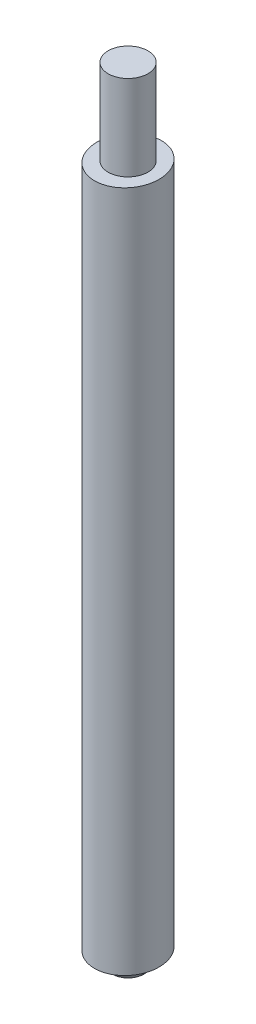
ISO-10303-21;
HEADER;
FILE_DESCRIPTION(('STEP AP214'),'2;1');
FILE_NAME('part.step','',(''),(''),'','','');
FILE_SCHEMA(('AUTOMOTIVE_DESIGN { 1 0 10303 214 1 1 1 1 }'));
ENDSEC;
DATA;
#1=APPLICATION_CONTEXT('core data for automotive mechanical design processes');
#2=APPLICATION_PROTOCOL_DEFINITION('international standard','automotive_design',2000,#1);
#3=PRODUCT_CONTEXT('',#1,'mechanical');
#4=PRODUCT('Part','Part','',(#3));
#5=PRODUCT_RELATED_PRODUCT_CATEGORY('part','',(#4));
#6=PRODUCT_DEFINITION_FORMATION('','',#4);
#7=PRODUCT_DEFINITION_CONTEXT('part definition',#1,'design');
#8=PRODUCT_DEFINITION('design','',#6,#7);
#9=PRODUCT_DEFINITION_SHAPE('','',#8);
#10=(LENGTH_UNIT() NAMED_UNIT(*) SI_UNIT(.MILLI.,.METRE.));
#11=(NAMED_UNIT(*) PLANE_ANGLE_UNIT() SI_UNIT($,.RADIAN.));
#12=(NAMED_UNIT(*) SI_UNIT($,.STERADIAN.) SOLID_ANGLE_UNIT());
#13=UNCERTAINTY_MEASURE_WITH_UNIT(LENGTH_MEASURE(1.E-05),#10,'distance_accuracy_value','');
#14=(GEOMETRIC_REPRESENTATION_CONTEXT(3) GLOBAL_UNCERTAINTY_ASSIGNED_CONTEXT((#13)) GLOBAL_UNIT_ASSIGNED_CONTEXT((#10,
#11,#12)) REPRESENTATION_CONTEXT('',''));
#15=CARTESIAN_POINT('',(0.,0.,0.));
#16=DIRECTION('',(0.,0.,1.));
#17=DIRECTION('',(1.,0.,0.));
#18=AXIS2_PLACEMENT_3D('',#15,#16,#17);
#19=CARTESIAN_POINT('',(-99.5832510074015,-22.870352222622,71.5449505559773));
#20=DIRECTION('',(0.,1.,0.));
#21=DIRECTION('',(1.,0.,0.));
#22=AXIS2_PLACEMENT_3D('',#19,#20,#21);
#23=PLANE('',#22);
#24=CARTESIAN_POINT('',(-96.5466540829582,-22.870352222622,77.6888931627985));
#25=CARTESIAN_POINT('',(-96.5466024115856,-22.870352222622,77.7217110537434));
#26=CARTESIAN_POINT('',(-96.5440582556821,-22.870352222622,77.7545139383835));
#27=CARTESIAN_POINT('',(-96.5390472767787,-22.870352222622,77.7869706485071));
#28=CARTESIAN_POINT('',(-96.5316683328519,-22.870352222622,77.8347649515097));
#29=CARTESIAN_POINT('',(-96.5189637767844,-22.8703522226164,77.8816564286544));
#30=CARTESIAN_POINT('',(-96.5011194939739,-22.8703522226164,77.9265981922167));
#31=CARTESIAN_POINT('',(-96.4722009205017,-22.8703522226164,77.999431138508));
#32=CARTESIAN_POINT('',(-96.4300380197235,-22.8703522226035,78.0664980948612));
#33=CARTESIAN_POINT('',(-96.3762481160368,-22.8703522226035,78.1233743738149));
#34=CARTESIAN_POINT('',(-96.3265885109153,-22.8703522226035,78.175883364537));
#35=CARTESIAN_POINT('',(-96.2677787319174,-22.8703522225925,78.2188786993219));
#36=CARTESIAN_POINT('',(-96.2022845901575,-22.8703522225925,78.2492453314144));
#37=CARTESIAN_POINT('',(-96.1404036395919,-22.8703522225925,78.2779366923341));
#38=CARTESIAN_POINT('',(-96.0738764668503,-22.8703522225814,78.2947223282512));
#39=CARTESIAN_POINT('',(-96.0058011706707,-22.8703522225814,78.2981584592726));
#40=CARTESIAN_POINT('',(-95.938106392847,-22.8703522225814,78.3015753834597));
#41=CARTESIAN_POINT('',(-95.8706592375868,-22.8703522225707,78.2916915807209));
#42=CARTESIAN_POINT('',(-95.8067741517704,-22.8703522225707,78.2690396767369));
#43=CARTESIAN_POINT('',(-95.7395275328239,-22.8703522225707,78.2451958650529));
#44=CARTESIAN_POINT('',(-95.6780937989401,-22.870352222622,78.2078830497993));
#45=CARTESIAN_POINT('',(-95.625319883913,-22.870352222622,78.1597835829877));
#46=CARTESIAN_POINT('',(-95.5687267193618,-22.870352222622,78.108203156584));
#47=CARTESIAN_POINT('',(-95.5234237996667,-22.8703522226117,78.0454663224445));
#48=CARTESIAN_POINT('',(-95.4910571519574,-22.8703522226117,77.9759685385292));
#49=CARTESIAN_POINT('',(-95.4560384352353,-22.8703522226117,77.9007762223644));
#50=CARTESIAN_POINT('',(-95.4367335475989,-22.870352222622,77.8189460424284));
#51=CARTESIAN_POINT('',(-95.4334596961054,-22.870352222622,77.735984861668));
#52=CARTESIAN_POINT('',(-95.4330921233536,-22.870352222622,77.7266703678484));
#53=CARTESIAN_POINT('',(-95.4329270851143,-22.870352222622,77.717353058822));
#54=CARTESIAN_POINT('',(-95.4329634956106,-22.8703522226221,77.7080404270808));
#55=B_SPLINE_CURVE_WITH_KNOTS('',3,(#24,#25,#26,#27,#28,#29,#30,#31,#32,#33,#34,#35,#36,#37,#38,
#39,#40,#41,#42,#43,#44,#45,#46,#47,#48,#49,#50,#51,#52,#53,#54),.UNSPECIFIED.,.F.,.F.,(4,3,3,3,
3,3,3,3,3,3,4),(0.00468065687562563,0.0145325449219714,0.0290399956352967,0.0525508749349579,
0.0742564535298472,0.094764575324147,0.115158063510846,0.136624625096453,0.159644722270168,
0.184551047728562,0.187347413600204),.UNSPECIFIED.);
#56=CARTESIAN_POINT('',(-96.54665405746,-22.870352222622,77.6888931627584));
#57=VERTEX_POINT('',#56);
#58=CARTESIAN_POINT('',(-95.432963477877,-22.870352222622,77.7080404270115));
#59=VERTEX_POINT('',#58);
#60=EDGE_CURVE('P0_E11',#57,#59,#55,.T.);
#61=ORIENTED_EDGE('',*,*,#60,.T.);
#62=CARTESIAN_POINT('',(-95.4329634956106,-22.8703522226221,77.7080404270808));
#63=CARTESIAN_POINT('',(-95.4332536325831,-22.8703522226224,77.6338327383096));
#64=CARTESIAN_POINT('',(-95.4463351524137,-22.8703522226238,77.5599220429451));
#65=CARTESIAN_POINT('',(-95.471658678746,-22.8703522226238,77.4900993579032));
#66=CARTESIAN_POINT('',(-95.4986622680001,-22.8703522226238,77.4156443597037));
#67=CARTESIAN_POINT('',(-95.5393063058934,-22.8703522226267,77.3466126942105));
#68=CARTESIAN_POINT('',(-95.5919594229849,-22.8703522226267,77.287553362915));
#69=CARTESIAN_POINT('',(-95.6404930833903,-22.8703522226267,77.2331146955161));
#70=CARTESIAN_POINT('',(-95.6985451053909,-22.8703522226243,77.1879417752959));
#71=CARTESIAN_POINT('',(-95.763684291754,-22.8703522226243,77.1553277087607));
#72=CARTESIAN_POINT('',(-95.8247396710747,-22.8703522226243,77.1247583339392));
#73=CARTESIAN_POINT('',(-95.8907845894538,-22.8703522226174,77.1058621143656));
#74=CARTESIAN_POINT('',(-95.9587861060318,-22.8703522226174,77.1002904823695));
#75=CARTESIAN_POINT('',(-96.0258921991616,-22.8703522226174,77.0947922159421));
#76=CARTESIAN_POINT('',(-96.0931495115276,-22.870352222608,77.1024257725012));
#77=CARTESIAN_POINT('',(-96.1572973280932,-22.870352222608,77.1228719139359));
#78=CARTESIAN_POINT('',(-96.2247319996104,-22.870352222608,77.1443656904237));
#79=CARTESIAN_POINT('',(-96.2867981147807,-22.870352222622,77.1793880307547));
#80=CARTESIAN_POINT('',(-96.3406425677685,-22.870352222622,77.2254048486341));
#81=CARTESIAN_POINT('',(-96.3810431223386,-22.870352222622,77.259932174268));
#82=CARTESIAN_POINT('',(-96.4161287374219,-22.870352222622,77.3000491742677));
#83=CARTESIAN_POINT('',(-96.4453250312548,-22.870352222622,77.3442694937709));
#84=B_SPLINE_CURVE_WITH_KNOTS('',3,(#62,#63,#64,#65,#66,#67,#68,#69,#70,#71,#72,#73,#74,#75,#76,
#77,#78,#79,#80,#81,#82,#83),.UNSPECIFIED.,.F.,.F.,(4,3,3,3,3,3,3,4),(0.187347413600204,
0.209630249866136,0.233391417645115,0.255293567252229,0.275822593278851,0.296081299286169,
0.31737803638669,0.33335739807863),.UNSPECIFIED.);
#85=CARTESIAN_POINT('',(-96.4453250312547,-22.870352222622,77.3442694937709));
#86=VERTEX_POINT('',#85);
#87=EDGE_CURVE('P0_E31',#59,#86,#84,.T.);
#88=ORIENTED_EDGE('',*,*,#87,.T.);
#89=CARTESIAN_POINT('',(-96.4453250312548,-22.870352222622,77.3442694937709));
#90=CARTESIAN_POINT('',(-96.4579423399502,-22.870352222622,77.3633795022185));
#91=CARTESIAN_POINT('',(-96.4694588568553,-22.8703522226207,77.3832564417114));
#92=CARTESIAN_POINT('',(-96.4798279819889,-22.8703522226207,77.4037805116341));
#93=CARTESIAN_POINT('',(-96.5172763288098,-22.8703522226207,77.4779036877693));
#94=CARTESIAN_POINT('',(-96.5391578744477,-22.870352222622,77.5592191852177));
#95=CARTESIAN_POINT('',(-96.5450371497492,-22.870352222622,77.6421429274782));
#96=CARTESIAN_POINT('',(-96.5461405717466,-22.870352222622,77.6577060499077));
#97=CARTESIAN_POINT('',(-96.5466786321577,-22.870352222622,77.6733012999828));
#98=CARTESIAN_POINT('',(-96.5466540829582,-22.870352222622,77.6888931627985));
#99=B_SPLINE_CURVE_WITH_KNOTS('',3,(#89,#90,#91,#92,#93,#94,#95,#96,#97,#98),.UNSPECIFIED.,.F.,
.F.,(4,3,3,4),(-0.0318451226781048,-0.0249395702002057,0.,0.00468065687562563),.UNSPECIFIED.);
#100=EDGE_CURVE('P0_E52',#86,#57,#99,.T.);
#101=ORIENTED_EDGE('',*,*,#100,.T.);
#102=EDGE_LOOP('',(#61,#88,#101));
#103=FACE_BOUND('',#102,.T.);
#104=ADVANCED_FACE('P0_F17',(#103),#23,.T.);
#105=CARTESIAN_POINT('',(-96.4453250312548,-22.870352222622,77.3442694937709));
#106=CARTESIAN_POINT('',(-96.4453250312548,-34.870352222622,77.3442694937709));
#107=CARTESIAN_POINT('',(-96.4161287374219,-22.870352222622,77.3000491742677));
#108=CARTESIAN_POINT('',(-96.4161287374219,-34.870352222622,77.3000491742677));
#109=CARTESIAN_POINT('',(-96.3810431223386,-22.870352222622,77.259932174268));
#110=CARTESIAN_POINT('',(-96.3810431223386,-34.870352222622,77.259932174268));
#111=CARTESIAN_POINT('',(-96.2867981147807,-22.870352222622,77.1793880307547));
#112=CARTESIAN_POINT('',(-96.2867981147807,-34.8703522226221,77.1793880307547));
#113=CARTESIAN_POINT('',(-96.2247319996104,-22.870352222608,77.1443656904237));
#114=CARTESIAN_POINT('',(-96.2247319996104,-34.870352222608,77.1443656904237));
#115=CARTESIAN_POINT('',(-96.0931495115276,-22.870352222608,77.1024257725012));
#116=CARTESIAN_POINT('',(-96.0931495115276,-34.870352222608,77.1024257725012));
#117=CARTESIAN_POINT('',(-96.0258921991616,-22.8703522226174,77.0947922159421));
#118=CARTESIAN_POINT('',(-96.0258921991616,-34.8703522226174,77.0947922159421));
#119=CARTESIAN_POINT('',(-95.8907845894538,-22.8703522226174,77.1058621143656));
#120=CARTESIAN_POINT('',(-95.8907845894538,-34.8703522226174,77.1058621143656));
#121=CARTESIAN_POINT('',(-95.8247396710747,-22.8703522226243,77.1247583339392));
#122=CARTESIAN_POINT('',(-95.8247396710747,-34.8703522226243,77.1247583339392));
#123=CARTESIAN_POINT('',(-95.6985451053909,-22.8703522226243,77.1879417752959));
#124=CARTESIAN_POINT('',(-95.6985451053909,-34.8703522226243,77.1879417752959));
#125=CARTESIAN_POINT('',(-95.6404930833903,-22.8703522226267,77.2331146955161));
#126=CARTESIAN_POINT('',(-95.6404930833903,-34.8703522226267,77.2331146955161));
#127=CARTESIAN_POINT('',(-95.5393063058934,-22.8703522226267,77.3466126942105));
#128=CARTESIAN_POINT('',(-95.5393063058934,-34.8703522226267,77.3466126942105));
#129=CARTESIAN_POINT('',(-95.4986622680001,-22.8703522226238,77.4156443597037));
#130=CARTESIAN_POINT('',(-95.4986622680001,-34.8703522226238,77.4156443597037));
#131=CARTESIAN_POINT('',(-95.4431571976892,-22.8703522226238,77.5686843823164));
#132=CARTESIAN_POINT('',(-95.4431571976892,-34.8703522226238,77.5686843823164));
#133=CARTESIAN_POINT('',(-95.4301631205624,-22.870352222622,77.6524478411091));
#134=CARTESIAN_POINT('',(-95.4301631205624,-34.870352222622,77.6524478411091));
#135=CARTESIAN_POINT('',(-95.4367335475989,-22.870352222622,77.8189460424284));
#136=CARTESIAN_POINT('',(-95.4367335475989,-34.870352222622,77.8189460424284));
#137=CARTESIAN_POINT('',(-95.4560384352353,-22.8703522226117,77.9007762223644));
#138=CARTESIAN_POINT('',(-95.4560384352353,-34.8703522226117,77.9007762223644));
#139=CARTESIAN_POINT('',(-95.5234237996667,-22.8703522226117,78.0454663224445));
#140=CARTESIAN_POINT('',(-95.5234237996667,-34.8703522226117,78.0454663224445));
#141=CARTESIAN_POINT('',(-95.5687267193618,-22.870352222622,78.108203156584));
#142=CARTESIAN_POINT('',(-95.5687267193618,-34.870352222622,78.108203156584));
#143=CARTESIAN_POINT('',(-95.6780937989401,-22.870352222622,78.2078830497993));
#144=CARTESIAN_POINT('',(-95.6780937989401,-34.870352222622,78.2078830497993));
#145=CARTESIAN_POINT('',(-95.7395275328239,-22.8703522225707,78.2451958650529));
#146=CARTESIAN_POINT('',(-95.7395275328239,-34.8703522225707,78.2451958650529));
#147=CARTESIAN_POINT('',(-95.8706592375868,-22.8703522225707,78.2916915807209));
#148=CARTESIAN_POINT('',(-95.8706592375868,-34.8703522225707,78.2916915807209));
#149=CARTESIAN_POINT('',(-95.938106392847,-22.8703522225814,78.3015753834597));
#150=CARTESIAN_POINT('',(-95.938106392847,-34.8703522225814,78.3015753834597));
#151=CARTESIAN_POINT('',(-96.0738764668503,-22.8703522225814,78.2947223282512));
#152=CARTESIAN_POINT('',(-96.0738764668503,-34.8703522225814,78.2947223282512));
#153=CARTESIAN_POINT('',(-96.1404036395919,-22.8703522225925,78.2779366923341));
#154=CARTESIAN_POINT('',(-96.1404036395919,-34.8703522225925,78.2779366923341));
#155=CARTESIAN_POINT('',(-96.2677787319174,-22.8703522225925,78.2188786993219));
#156=CARTESIAN_POINT('',(-96.2677787319174,-34.8703522225925,78.2188786993219));
#157=CARTESIAN_POINT('',(-96.3265885109153,-22.8703522226035,78.175883364537));
#158=CARTESIAN_POINT('',(-96.3265885109153,-34.8703522226035,78.175883364537));
#159=CARTESIAN_POINT('',(-96.4300380197235,-22.8703522226035,78.0664980948612));
#160=CARTESIAN_POINT('',(-96.4300380197235,-34.8703522226035,78.0664980948612));
#161=CARTESIAN_POINT('',(-96.4722009205017,-22.8703522226164,77.999431138508));
#162=CARTESIAN_POINT('',(-96.4722009205017,-34.8703522226164,77.999431138508));
#163=CARTESIAN_POINT('',(-96.5189637767844,-22.8703522226164,77.8816564286544));
#164=CARTESIAN_POINT('',(-96.5189637767844,-34.8703522226164,77.8816564286544));
#165=CARTESIAN_POINT('',(-96.5316683328519,-22.870352222622,77.8347649515097));
#166=CARTESIAN_POINT('',(-96.5316683328519,-34.870352222622,77.8347649515097));
#167=CARTESIAN_POINT('',(-96.5464389844061,-22.870352222622,77.7390936734875));
#168=CARTESIAN_POINT('',(-96.5464389844061,-34.870352222622,77.7390936734875));
#169=CARTESIAN_POINT('',(-96.5484630641392,-22.870352222622,77.6904634478331));
#170=CARTESIAN_POINT('',(-96.5484630641392,-34.870352222622,77.6904634478331));
#171=CARTESIAN_POINT('',(-96.5450371497492,-22.870352222622,77.6421429274782));
#172=CARTESIAN_POINT('',(-96.5450371497492,-34.870352222622,77.6421429274782));
#173=CARTESIAN_POINT('',(-96.5391578744477,-22.870352222622,77.5592191852177));
#174=CARTESIAN_POINT('',(-96.5391578744477,-34.870352222622,77.5592191852177));
#175=CARTESIAN_POINT('',(-96.5172763288098,-22.8703522226207,77.4779036877693));
#176=CARTESIAN_POINT('',(-96.5172763288098,-34.8703522226207,77.4779036877693));
#177=CARTESIAN_POINT('',(-96.4694588568553,-22.8703522226207,77.3832564417114));
#178=CARTESIAN_POINT('',(-96.4694588568553,-34.8703522226207,77.3832564417114));
#179=CARTESIAN_POINT('',(-96.4579423399502,-22.870352222622,77.3633795022185));
#180=CARTESIAN_POINT('',(-96.4579423399502,-34.870352222622,77.3633795022185));
#181=CARTESIAN_POINT('',(-96.4453250312548,-22.870352222622,77.3442694937709));
#182=CARTESIAN_POINT('',(-96.4453250312548,-34.870352222622,77.3442694937709));
#183=B_SPLINE_SURFACE_WITH_KNOTS('',3,1,((#105,#106),(#107,#108),(#109,#110),(#111,#112),(#113,
#114),(#115,#116),(#117,#118),(#119,#120),(#121,#122),(#123,#124),(#125,#126),(#127,#128),(#129,
#130),(#131,#132),(#133,#134),(#135,#136),(#137,#138),(#139,#140),(#141,#142),(#143,#144),(#145,
#146),(#147,#148),(#149,#150),(#151,#152),(#153,#154),(#155,#156),(#157,#158),(#159,#160),(#161,
#162),(#163,#164),(#165,#166),(#167,#168),(#169,#170),(#171,#172),(#173,#174),(#175,#176),(#177,
#178),(#179,#180),(#181,#182)),.UNSPECIFIED.,.T.,.F.,.F.,(4,2,2,2,2,2,2,2,2,2,2,2,2,2,2,2,3,2,
4),(2,2),(-0.33335739807863,-0.31737803638669,-0.296081299286169,-0.275822593278851,
-0.255293567252229,-0.233391417645115,-0.209630249866136,-0.184551047728562,-0.159644722270168,
-0.136624625096453,-0.115158063510846,-0.0947645753241469,-0.0742564535298472,
-0.0525508749349579,-0.0290399956352967,-0.0145325449219714,0.,0.0249395702002057,
0.0318451226781048),(0.,1.2),.UNSPECIFIED.);
#184=CARTESIAN_POINT('',(-96.4453250312548,-34.870352222622,77.3442694937709));
#185=CARTESIAN_POINT('',(-96.4161287374219,-34.870352222622,77.3000491742677));
#186=CARTESIAN_POINT('',(-96.3810431223386,-34.870352222622,77.259932174268));
#187=CARTESIAN_POINT('',(-96.3406425677685,-34.870352222622,77.2254048486341));
#188=CARTESIAN_POINT('',(-96.2867981147807,-34.870352222622,77.1793880307547));
#189=CARTESIAN_POINT('',(-96.2247319996104,-34.870352222608,77.1443656904237));
#190=CARTESIAN_POINT('',(-96.1572973280932,-34.870352222608,77.1228719139359));
#191=CARTESIAN_POINT('',(-96.0931495115276,-34.870352222608,77.1024257725012));
#192=CARTESIAN_POINT('',(-96.0258921991616,-34.8703522226174,77.0947922159421));
#193=CARTESIAN_POINT('',(-95.9587861060318,-34.8703522226174,77.1002904823695));
#194=CARTESIAN_POINT('',(-95.8907845894538,-34.8703522226174,77.1058621143656));
#195=CARTESIAN_POINT('',(-95.8247396710747,-34.8703522226243,77.1247583339392));
#196=CARTESIAN_POINT('',(-95.763684291754,-34.8703522226243,77.1553277087607));
#197=CARTESIAN_POINT('',(-95.6985451053909,-34.8703522226243,77.1879417752959));
#198=CARTESIAN_POINT('',(-95.6404930833903,-34.8703522226267,77.2331146955161));
#199=CARTESIAN_POINT('',(-95.5919594229849,-34.8703522226267,77.287553362915));
#200=CARTESIAN_POINT('',(-95.5393063058934,-34.8703522226266,77.3466126942105));
#201=CARTESIAN_POINT('',(-95.4986622680001,-34.8703522226237,77.4156443597037));
#202=CARTESIAN_POINT('',(-95.471658678746,-34.8703522226237,77.4900993579032));
#203=CARTESIAN_POINT('',(-95.4431571976892,-34.8703522226237,77.5686843823164));
#204=CARTESIAN_POINT('',(-95.4301631205624,-34.870352222622,77.6524478411091));
#205=CARTESIAN_POINT('',(-95.4334596961054,-34.870352222622,77.735984861668));
#206=CARTESIAN_POINT('',(-95.4367335475989,-34.870352222622,77.8189460424284));
#207=CARTESIAN_POINT('',(-95.4560384352353,-34.8703522226117,77.9007762223644));
#208=CARTESIAN_POINT('',(-95.4910571519574,-34.8703522226117,77.9759685385292));
#209=CARTESIAN_POINT('',(-95.5234237996667,-34.8703522226117,78.0454663224445));
#210=CARTESIAN_POINT('',(-95.5687267193618,-34.8703522226219,78.108203156584));
#211=CARTESIAN_POINT('',(-95.625319883913,-34.8703522226219,78.1597835829877));
#212=CARTESIAN_POINT('',(-95.6780937989401,-34.8703522226219,78.2078830497993));
#213=CARTESIAN_POINT('',(-95.7395275328239,-34.8703522225706,78.2451958650529));
#214=CARTESIAN_POINT('',(-95.8067741517704,-34.8703522225706,78.2690396767369));
#215=CARTESIAN_POINT('',(-95.8706592375868,-34.8703522225706,78.2916915807209));
#216=CARTESIAN_POINT('',(-95.938106392847,-34.8703522225813,78.3015753834597));
#217=CARTESIAN_POINT('',(-96.0058011706707,-34.8703522225813,78.2981584592726));
#218=CARTESIAN_POINT('',(-96.0738764668503,-34.8703522225813,78.2947223282512));
#219=CARTESIAN_POINT('',(-96.1404036395919,-34.8703522225925,78.2779366923341));
#220=CARTESIAN_POINT('',(-96.2022845901575,-34.8703522225925,78.2492453314144));
#221=CARTESIAN_POINT('',(-96.2677787319174,-34.8703522225925,78.2188786993219));
#222=CARTESIAN_POINT('',(-96.3265885109153,-34.8703522226034,78.175883364537));
#223=CARTESIAN_POINT('',(-96.3762481160368,-34.8703522226034,78.1233743738149));
#224=CARTESIAN_POINT('',(-96.4300380197235,-34.8703522226034,78.0664980948612));
#225=CARTESIAN_POINT('',(-96.4722009205017,-34.8703522226163,77.999431138508));
#226=CARTESIAN_POINT('',(-96.5011194939739,-34.8703522226163,77.9265981922167));
#227=CARTESIAN_POINT('',(-96.5189637767844,-34.8703522226163,77.8816564286544));
#228=CARTESIAN_POINT('',(-96.5316683328519,-34.8703522226219,77.8347649515097));
#229=CARTESIAN_POINT('',(-96.5390472767787,-34.8703522226219,77.7869706485071));
#230=CARTESIAN_POINT('',(-96.5464389844061,-34.8703522226219,77.7390936734875));
#231=CARTESIAN_POINT('',(-96.5484630641392,-34.8703522226218,77.6904634478331));
#232=CARTESIAN_POINT('',(-96.5450371497492,-34.8703522226218,77.6421429274782));
#233=CARTESIAN_POINT('',(-96.5391578744477,-34.8703522226218,77.5592191852177));
#234=CARTESIAN_POINT('',(-96.5172763288098,-34.8703522226205,77.4779036877693));
#235=CARTESIAN_POINT('',(-96.4798279819889,-34.8703522226205,77.4037805116341));
#236=CARTESIAN_POINT('',(-96.4694588568553,-34.8703522226205,77.3832564417115));
#237=CARTESIAN_POINT('',(-96.4579423399502,-34.8703522226219,77.3633795022185));
#238=CARTESIAN_POINT('',(-96.4453250312548,-34.870352222622,77.3442694937709));
#239=B_SPLINE_CURVE_WITH_KNOTS('',3,(#184,#185,#186,#187,#188,#189,#190,#191,#192,#193,#194,
#195,#196,#197,#198,#199,#200,#201,#202,#203,#204,#205,#206,#207,#208,#209,#210,#211,#212,#213,
#214,#215,#216,#217,#218,#219,#220,#221,#222,#223,#224,#225,#226,#227,#228,#229,#230,#231,#232,
#233,#234,#235,#236,#237,#238),.UNSPECIFIED.,.T.,.F.,(4,3,3,3,3,3,3,3,3,3,3,3,3,3,3,3,3,3,4),
(-0.33335739807863,-0.31737803638669,-0.296081299286168,-0.27582259327885,-0.255293567252229,
-0.233391417645114,-0.209630249866135,-0.184551047728561,-0.159644722270167,-0.136624625096452,
-0.115158063510844,-0.0947645753241454,-0.0742564535298456,-0.0525508749349561,
-0.0290399956352948,-0.0145325449219694,0.,0.024939570200208,0.0318451226781048),.UNSPECIFIED.);
#240=CARTESIAN_POINT('',(-96.4453250312548,-34.870352222622,77.3442694937709));
#241=VERTEX_POINT('',#240);
#242=EDGE_CURVE('P0_E23',#241,#241,#239,.T.);
#243=ORIENTED_EDGE('',*,*,#242,.F.);
#244=EDGE_LOOP('',(#243));
#245=FACE_BOUND('',#244,.T.);
#246=ORIENTED_EDGE('',*,*,#100,.F.);
#247=ORIENTED_EDGE('',*,*,#87,.F.);
#248=ORIENTED_EDGE('',*,*,#60,.F.);
#249=EDGE_LOOP('',(#246,#247,#248));
#250=FACE_BOUND('',#249,.T.);
#251=ADVANCED_FACE('P0_F19',(#245,#250),#183,.T.);
#252=CARTESIAN_POINT('',(-99.7399965644509,-34.870352222622,71.7040607694052));
#253=DIRECTION('',(0.,1.,0.));
#254=DIRECTION('',(1.,0.,0.));
#255=AXIS2_PLACEMENT_3D('',#252,#253,#254);
#256=PLANE('',#255);
#257=ORIENTED_EDGE('',*,*,#242,.T.);
#258=EDGE_LOOP('',(#257));
#259=FACE_BOUND('',#258,.T.);
#260=ADVANCED_FACE('P0_F80',(#259),#256,.F.);
#261=CLOSED_SHELL('',(#104,#251,#260));
#262=MANIFOLD_SOLID_BREP('P0_B1',#261);
#263=CARTESIAN_POINT('',(-81.665808000505,-21.3703528404236,27.730238100206));
#264=DIRECTION('',(0.,1.,0.));
#265=DIRECTION('',(0.,0.,-1.));
#266=AXIS2_PLACEMENT_3D('',#263,#264,#265);
#267=PLANE('',#266);
#268=CARTESIAN_POINT('',(-95.9898087676685,-21.3703528404236,77.698466794885));
#269=DIRECTION('',(0.,1.,0.));
#270=DIRECTION('',(2.1425115015461E-09,0.,1.));
#271=AXIS2_PLACEMENT_3D('',#268,#269,#270);
#272=CIRCLE('',#271,0.35);
#273=CARTESIAN_POINT('',(-95.9898087669186,-21.3703528404236,78.048466794885));
#274=VERTEX_POINT('',#273);
#275=EDGE_CURVE('P1_E10',#274,#274,#272,.T.);
#276=ORIENTED_EDGE('',*,*,#275,.T.);
#277=EDGE_LOOP('',(#276));
#278=FACE_BOUND('',#277,.T.);
#279=ADVANCED_FACE('P1_F15',(#278),#267,.T.);
#280=CARTESIAN_POINT('',(-95.9898087676685,-22.8703528404236,77.698466794885));
#281=DIRECTION('',(0.,1.,0.));
#282=DIRECTION('',(2.1425115015461E-09,0.,1.));
#283=AXIS2_PLACEMENT_3D('',#280,#281,#282);
#284=CYLINDRICAL_SURFACE('',#283,0.35);
#285=CARTESIAN_POINT('',(-95.9898087676685,-34.9703528404236,77.698466794885));
#286=DIRECTION('',(0.,-1.,0.));
#287=DIRECTION('',(2.14248936052691E-09,0.,1.));
#288=AXIS2_PLACEMENT_3D('',#285,#286,#287);
#289=CIRCLE('',#288,0.35);
#290=CARTESIAN_POINT('',(-95.9898087669186,-34.9703528404236,78.048466794885));
#291=VERTEX_POINT('',#290);
#292=EDGE_CURVE('P1_E23',#291,#291,#289,.T.);
#293=ORIENTED_EDGE('',*,*,#292,.F.);
#294=EDGE_LOOP('',(#293));
#295=FACE_BOUND('',#294,.T.);
#296=ORIENTED_EDGE('',*,*,#275,.F.);
#297=EDGE_LOOP('',(#296));
#298=FACE_BOUND('',#297,.T.);
#299=ADVANCED_FACE('P1_F49',(#295,#298),#284,.T.);
#300=CARTESIAN_POINT('',(-81.665808000505,-35.1703528404236,27.730238100206));
#301=DIRECTION('',(0.,1.,0.));
#302=DIRECTION('',(0.,0.,-1.));
#303=AXIS2_PLACEMENT_3D('',#300,#301,#302);
#304=PLANE('',#303);
#305=CARTESIAN_POINT('',(-95.9898087676685,-35.1703528404236,77.698466794885));
#306=DIRECTION('',(0.,1.,0.));
#307=DIRECTION('',(2.14248936052691E-09,0.,1.));
#308=AXIS2_PLACEMENT_3D('',#305,#306,#307);
#309=CIRCLE('',#308,0.15);
#310=CARTESIAN_POINT('',(-95.9898087673471,-35.1703528404236,77.848466794885));
#311=VERTEX_POINT('',#310);
#312=EDGE_CURVE('P1_E33',#311,#311,#309,.T.);
#313=ORIENTED_EDGE('',*,*,#312,.F.);
#314=EDGE_LOOP('',(#313));
#315=FACE_BOUND('',#314,.T.);
#316=ADVANCED_FACE('P1_F47',(#315),#304,.F.);
#317=CARTESIAN_POINT('',(-95.9898087676684,-34.9703528404237,77.698466794885));
#318=DIRECTION('',(0.,-1.,0.));
#319=DIRECTION('',(0.,0.,-1.));
#320=AXIS2_PLACEMENT_3D('',#317,#318,#319);
#321=DEGENERATE_TOROIDAL_SURFACE('',#320,0.149999999999914,0.199999999999944,.T.);
#322=ORIENTED_EDGE('',*,*,#292,.T.);
#323=EDGE_LOOP('',(#322));
#324=FACE_BOUND('',#323,.T.);
#325=ORIENTED_EDGE('',*,*,#312,.T.);
#326=EDGE_LOOP('',(#325));
#327=FACE_BOUND('',#326,.T.);
#328=ADVANCED_FACE('P1_F17',(#324,#327),#321,.T.);
#329=CLOSED_SHELL('',(#279,#299,#316,#328));
#330=MANIFOLD_SOLID_BREP('P1_B1',#329);
#331=ADVANCED_BREP_SHAPE_REPRESENTATION('',(#18,#262,#330),#14);
#332=SHAPE_DEFINITION_REPRESENTATION(#9,#331);
ENDSEC;
END-ISO-10303-21;
